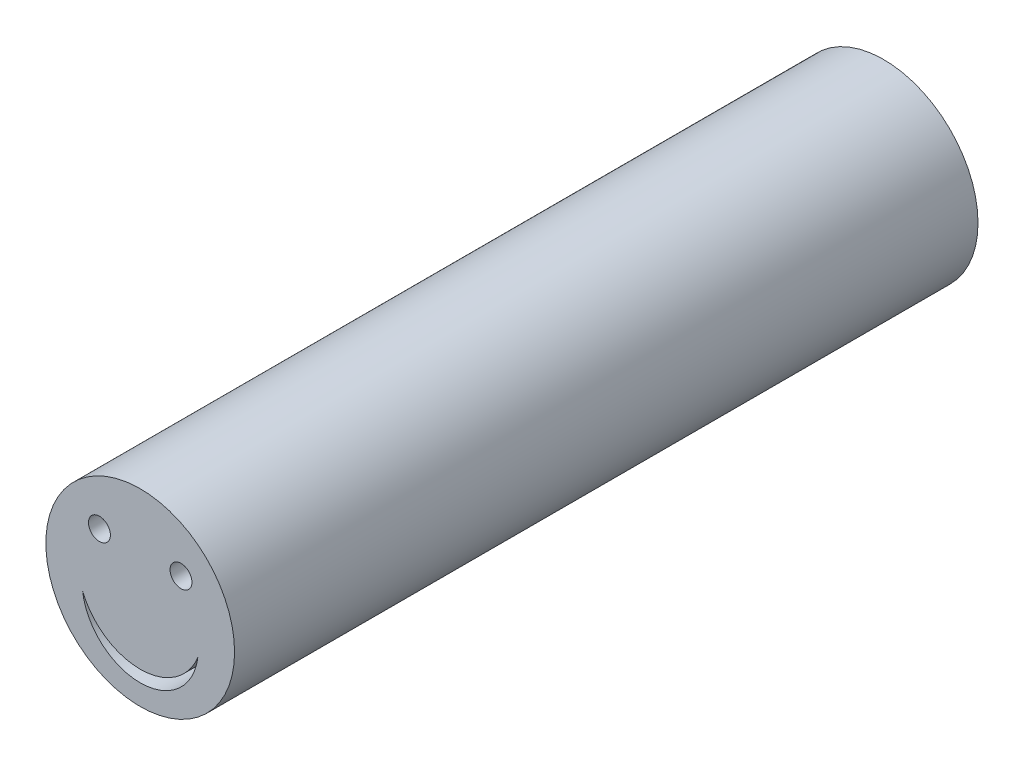
ISO-10303-21;
HEADER;
FILE_DESCRIPTION(('STEP AP214'),'2;1');
FILE_NAME('part.step','',(''),(''),'','','');
FILE_SCHEMA(('AUTOMOTIVE_DESIGN { 1 0 10303 214 1 1 1 1 }'));
ENDSEC;
DATA;
#1=APPLICATION_CONTEXT('core data for automotive mechanical design processes');
#2=APPLICATION_PROTOCOL_DEFINITION('international standard','automotive_design',2000,#1);
#3=PRODUCT_CONTEXT('',#1,'mechanical');
#4=PRODUCT('Part','Part','',(#3));
#5=PRODUCT_RELATED_PRODUCT_CATEGORY('part','',(#4));
#6=PRODUCT_DEFINITION_FORMATION('','',#4);
#7=PRODUCT_DEFINITION_CONTEXT('part definition',#1,'design');
#8=PRODUCT_DEFINITION('design','',#6,#7);
#9=PRODUCT_DEFINITION_SHAPE('','',#8);
#10=(LENGTH_UNIT() NAMED_UNIT(*) SI_UNIT(.MILLI.,.METRE.));
#11=(NAMED_UNIT(*) PLANE_ANGLE_UNIT() SI_UNIT($,.RADIAN.));
#12=(NAMED_UNIT(*) SI_UNIT($,.STERADIAN.) SOLID_ANGLE_UNIT());
#13=UNCERTAINTY_MEASURE_WITH_UNIT(LENGTH_MEASURE(1.E-05),#10,'distance_accuracy_value','');
#14=(GEOMETRIC_REPRESENTATION_CONTEXT(3) GLOBAL_UNCERTAINTY_ASSIGNED_CONTEXT((#13)) GLOBAL_UNIT_ASSIGNED_CONTEXT((#10,
#11,#12)) REPRESENTATION_CONTEXT('',''));
#15=CARTESIAN_POINT('',(0.,0.,0.));
#16=DIRECTION('',(0.,0.,1.));
#17=DIRECTION('',(1.,0.,0.));
#18=AXIS2_PLACEMENT_3D('',#15,#16,#17);
#19=CARTESIAN_POINT('',(0.,0.,140.));
#20=DIRECTION('',(0.,0.,-1.));
#21=DIRECTION('',(-1.,0.,0.));
#22=AXIS2_PLACEMENT_3D('',#19,#20,#21);
#23=CYLINDRICAL_SURFACE('',#22,35.5406);
#24=CARTESIAN_POINT('',(0.,0.,140.));
#25=DIRECTION('',(0.,0.,1.));
#26=DIRECTION('',(1.,0.,0.));
#27=AXIS2_PLACEMENT_3D('',#24,#25,#26);
#28=CIRCLE('',#27,35.5406);
#29=CARTESIAN_POINT('',(35.5406,0.,140.));
#30=VERTEX_POINT('',#29);
#31=EDGE_CURVE('E11',#30,#30,#28,.T.);
#32=ORIENTED_EDGE('',*,*,#31,.F.);
#33=EDGE_LOOP('',(#32));
#34=FACE_BOUND('',#33,.T.);
#35=CARTESIAN_POINT('',(0.,0.,-140.));
#36=DIRECTION('',(0.,0.,1.));
#37=DIRECTION('',(1.,0.,0.));
#38=AXIS2_PLACEMENT_3D('',#35,#36,#37);
#39=CIRCLE('',#38,35.5406);
#40=CARTESIAN_POINT('',(35.5406,0.,-140.));
#41=VERTEX_POINT('',#40);
#42=EDGE_CURVE('E44',#41,#41,#39,.T.);
#43=ORIENTED_EDGE('',*,*,#42,.T.);
#44=EDGE_LOOP('',(#43));
#45=FACE_BOUND('',#44,.T.);
#46=ADVANCED_FACE('F41',(#34,#45),#23,.T.);
#47=CARTESIAN_POINT('',(0.,0.,140.));
#48=DIRECTION('',(0.,0.,1.));
#49=DIRECTION('',(1.,0.,0.));
#50=AXIS2_PLACEMENT_3D('',#47,#48,#49);
#51=PLANE('',#50);
#52=CARTESIAN_POINT('',(0.,-5.89992818257524,140.));
#53=DIRECTION('',(0.,0.,1.));
#54=DIRECTION('',(1.,0.,0.));
#55=AXIS2_PLACEMENT_3D('',#52,#53,#54);
#56=CIRCLE('',#55,21.8849475023962);
#57=CARTESIAN_POINT('',(-21.7187065597753,-8.59227150262406,140.));
#58=VERTEX_POINT('',#57);
#59=CARTESIAN_POINT('',(21.7187065597753,-8.59227150262408,140.));
#60=VERTEX_POINT('',#59);
#61=EDGE_CURVE('E69',#58,#60,#56,.T.);
#62=ORIENTED_EDGE('',*,*,#61,.F.);
#63=CARTESIAN_POINT('',(0.,0.,140.));
#64=DIRECTION('',(0.,0.,1.));
#65=DIRECTION('',(1.,0.,0.));
#66=AXIS2_PLACEMENT_3D('',#63,#64,#65);
#67=CIRCLE('',#66,23.3565696155157);
#68=EDGE_CURVE('E95',#60,#58,#67,.F.);
#69=ORIENTED_EDGE('',*,*,#68,.F.);
#70=EDGE_LOOP('',(#62,#69));
#71=FACE_BOUND('',#70,.T.);
#72=CARTESIAN_POINT('',(15.3639028217656,14.7434012402313,140.));
#73=DIRECTION('',(0.,0.,1.));
#74=DIRECTION('',(1.,0.,0.));
#75=AXIS2_PLACEMENT_3D('',#72,#73,#74);
#76=CIRCLE('',#75,4.13177504839256);
#77=CARTESIAN_POINT('',(19.4956778701582,14.7434012402313,140.));
#78=VERTEX_POINT('',#77);
#79=EDGE_CURVE('E92',#78,#78,#76,.T.);
#80=ORIENTED_EDGE('',*,*,#79,.F.);
#81=EDGE_LOOP('',(#80));
#82=FACE_BOUND('',#81,.T.);
#83=CARTESIAN_POINT('',(-15.3639028217656,14.7434012402313,140.));
#84=DIRECTION('',(0.,0.,1.));
#85=DIRECTION('',(1.,0.,0.));
#86=AXIS2_PLACEMENT_3D('',#83,#84,#85);
#87=CIRCLE('',#86,4.13177504839256);
#88=CARTESIAN_POINT('',(-11.232127773373,14.7434012402313,140.));
#89=VERTEX_POINT('',#88);
#90=EDGE_CURVE('E89',#89,#89,#87,.T.);
#91=ORIENTED_EDGE('',*,*,#90,.F.);
#92=EDGE_LOOP('',(#91));
#93=FACE_BOUND('',#92,.T.);
#94=ORIENTED_EDGE('',*,*,#31,.T.);
#95=EDGE_LOOP('',(#94));
#96=FACE_BOUND('',#95,.T.);
#97=ADVANCED_FACE('F103',(#71,#82,#93,#96),#51,.T.);
#98=CARTESIAN_POINT('',(0.,0.,-140.));
#99=DIRECTION('',(0.,0.,1.));
#100=DIRECTION('',(1.,0.,0.));
#101=AXIS2_PLACEMENT_3D('',#98,#99,#100);
#102=PLANE('',#101);
#103=CARTESIAN_POINT('',(0.,0.,-140.));
#104=DIRECTION('',(0.,0.,-1.));
#105=DIRECTION('',(1.,0.,0.));
#106=AXIS2_PLACEMENT_3D('',#103,#104,#105);
#107=CIRCLE('',#106,23.3565696155157);
#108=CARTESIAN_POINT('',(21.7187065597753,-8.59227150262408,-140.));
#109=VERTEX_POINT('',#108);
#110=CARTESIAN_POINT('',(-21.7187065597753,-8.59227150262406,-140.));
#111=VERTEX_POINT('',#110);
#112=EDGE_CURVE('E71',#109,#111,#107,.T.);
#113=ORIENTED_EDGE('',*,*,#112,.T.);
#114=CARTESIAN_POINT('',(0.,-5.89992818257524,-140.));
#115=DIRECTION('',(0.,0.,1.));
#116=DIRECTION('',(1.,0.,0.));
#117=AXIS2_PLACEMENT_3D('',#114,#115,#116);
#118=CIRCLE('',#117,21.8849475023962);
#119=EDGE_CURVE('E62',#111,#109,#118,.T.);
#120=ORIENTED_EDGE('',*,*,#119,.T.);
#121=EDGE_LOOP('',(#113,#120));
#122=FACE_BOUND('',#121,.T.);
#123=CARTESIAN_POINT('',(15.3639028217656,14.7434012402313,-140.));
#124=DIRECTION('',(0.,0.,1.));
#125=DIRECTION('',(-1.,0.,0.));
#126=AXIS2_PLACEMENT_3D('',#123,#124,#125);
#127=CIRCLE('',#126,4.13177504839256);
#128=CARTESIAN_POINT('',(11.232127773373,14.7434012402313,-140.));
#129=VERTEX_POINT('',#128);
#130=EDGE_CURVE('E80',#129,#129,#127,.T.);
#131=ORIENTED_EDGE('',*,*,#130,.T.);
#132=EDGE_LOOP('',(#131));
#133=FACE_BOUND('',#132,.T.);
#134=CARTESIAN_POINT('',(-15.3639028217656,14.7434012402313,-140.));
#135=DIRECTION('',(0.,0.,1.));
#136=DIRECTION('',(1.,0.,0.));
#137=AXIS2_PLACEMENT_3D('',#134,#135,#136);
#138=CIRCLE('',#137,4.13177504839256);
#139=CARTESIAN_POINT('',(-11.232127773373,14.7434012402313,-140.));
#140=VERTEX_POINT('',#139);
#141=EDGE_CURVE('E83',#140,#140,#138,.T.);
#142=ORIENTED_EDGE('',*,*,#141,.T.);
#143=EDGE_LOOP('',(#142));
#144=FACE_BOUND('',#143,.T.);
#145=ORIENTED_EDGE('',*,*,#42,.F.);
#146=EDGE_LOOP('',(#145));
#147=FACE_BOUND('',#146,.T.);
#148=ADVANCED_FACE('F78',(#122,#133,#144,#147),#102,.F.);
#149=CARTESIAN_POINT('',(-15.3639028217656,14.7434012402313,-140.));
#150=DIRECTION('',(0.,0.,1.));
#151=DIRECTION('',(1.,0.,0.));
#152=AXIS2_PLACEMENT_3D('',#149,#150,#151);
#153=CYLINDRICAL_SURFACE('',#152,4.13177504839256);
#154=ORIENTED_EDGE('',*,*,#90,.T.);
#155=EDGE_LOOP('',(#154));
#156=FACE_BOUND('',#155,.T.);
#157=ORIENTED_EDGE('',*,*,#141,.F.);
#158=EDGE_LOOP('',(#157));
#159=FACE_BOUND('',#158,.T.);
#160=ADVANCED_FACE('F102',(#156,#159),#153,.F.);
#161=CARTESIAN_POINT('',(15.3639028217656,14.7434012402313,-140.));
#162=DIRECTION('',(0.,0.,1.));
#163=DIRECTION('',(1.,0.,0.));
#164=AXIS2_PLACEMENT_3D('',#161,#162,#163);
#165=CYLINDRICAL_SURFACE('',#164,4.13177504839256);
#166=ORIENTED_EDGE('',*,*,#79,.T.);
#167=EDGE_LOOP('',(#166));
#168=FACE_BOUND('',#167,.T.);
#169=ORIENTED_EDGE('',*,*,#130,.F.);
#170=EDGE_LOOP('',(#169));
#171=FACE_BOUND('',#170,.T.);
#172=ADVANCED_FACE('F108',(#168,#171),#165,.F.);
#173=CARTESIAN_POINT('',(0.,-5.89992818257524,-140.));
#174=DIRECTION('',(0.,0.,1.));
#175=DIRECTION('',(1.,0.,0.));
#176=AXIS2_PLACEMENT_3D('',#173,#174,#175);
#177=CYLINDRICAL_SURFACE('',#176,21.8849475023962);
#178=ORIENTED_EDGE('',*,*,#61,.T.);
#179=DIRECTION('',(0.,0.,1.));
#180=VECTOR('',#179,1.);
#181=CARTESIAN_POINT('',(21.7187065597753,-8.59227150262408,-140.));
#182=LINE('',#181,#180);
#183=EDGE_CURVE('E55',#109,#60,#182,.T.);
#184=ORIENTED_EDGE('',*,*,#183,.F.);
#185=ORIENTED_EDGE('',*,*,#119,.F.);
#186=DIRECTION('',(0.,0.,1.));
#187=VECTOR('',#186,1.);
#188=CARTESIAN_POINT('',(-21.7187065597753,-8.59227150262406,-140.));
#189=LINE('',#188,#187);
#190=EDGE_CURVE('E72',#111,#58,#189,.T.);
#191=ORIENTED_EDGE('',*,*,#190,.T.);
#192=EDGE_LOOP('',(#178,#184,#185,#191));
#193=FACE_BOUND('',#192,.T.);
#194=ADVANCED_FACE('F67',(#193),#177,.F.);
#195=CARTESIAN_POINT('',(0.,0.,-140.));
#196=DIRECTION('',(0.,0.,1.));
#197=DIRECTION('',(1.,0.,0.));
#198=AXIS2_PLACEMENT_3D('',#195,#196,#197);
#199=CYLINDRICAL_SURFACE('',#198,23.3565696155157);
#200=ORIENTED_EDGE('',*,*,#68,.T.);
#201=ORIENTED_EDGE('',*,*,#190,.F.);
#202=ORIENTED_EDGE('',*,*,#112,.F.);
#203=ORIENTED_EDGE('',*,*,#183,.T.);
#204=EDGE_LOOP('',(#200,#201,#202,#203));
#205=FACE_BOUND('',#204,.T.);
#206=ADVANCED_FACE('F75',(#205),#199,.T.);
#207=CLOSED_SHELL('',(#46,#97,#148,#160,#172,#194,#206));
#208=MANIFOLD_SOLID_BREP('B2',#207);
#209=ADVANCED_BREP_SHAPE_REPRESENTATION('',(#18,#208),#14);
#210=SHAPE_DEFINITION_REPRESENTATION(#9,#209);
ENDSEC;
END-ISO-10303-21;
